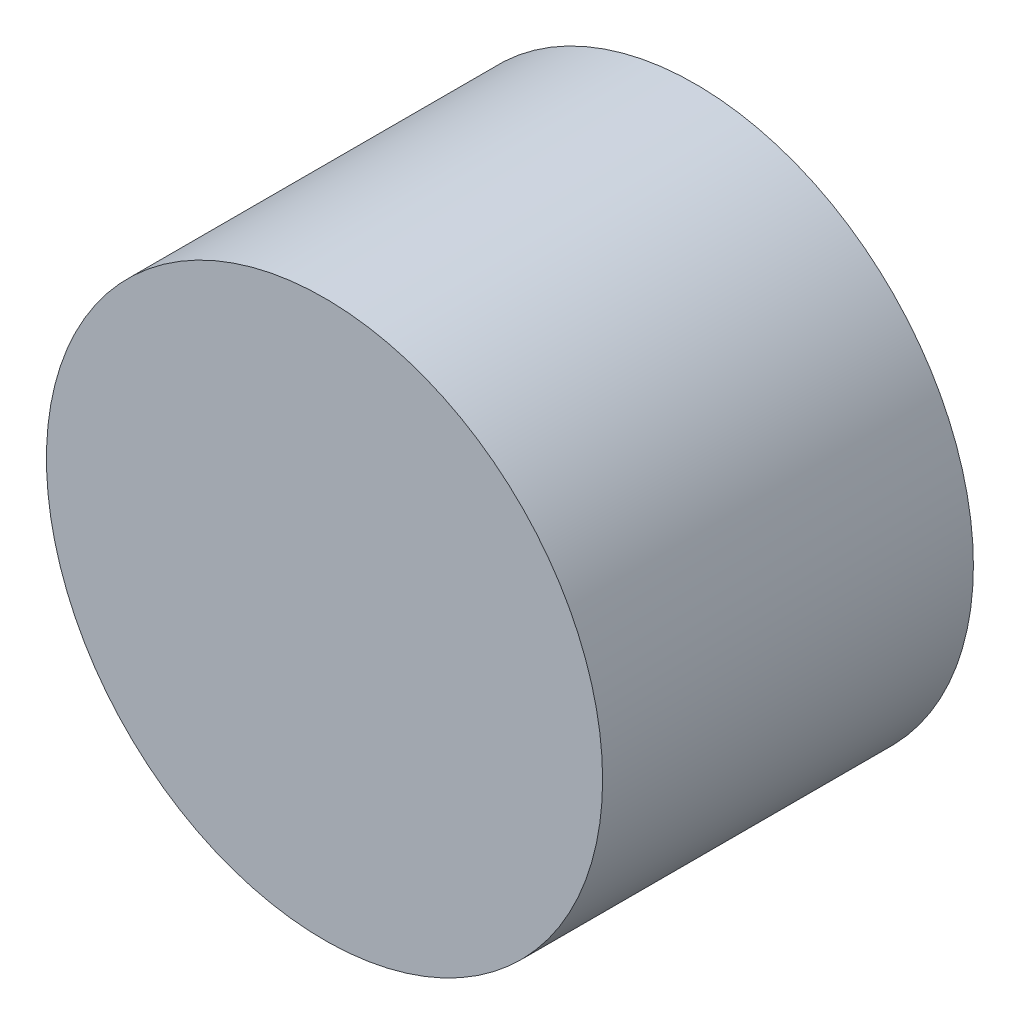
ISO-10303-21;
HEADER;
FILE_DESCRIPTION(('STEP AP214'),'2;1');
FILE_NAME('part.step','',(''),(''),'','','');
FILE_SCHEMA(('AUTOMOTIVE_DESIGN { 1 0 10303 214 1 1 1 1 }'));
ENDSEC;
DATA;
#1=APPLICATION_CONTEXT('core data for automotive mechanical design processes');
#2=APPLICATION_PROTOCOL_DEFINITION('international standard','automotive_design',2000,#1);
#3=PRODUCT_CONTEXT('',#1,'mechanical');
#4=PRODUCT('Part','Part','',(#3));
#5=PRODUCT_RELATED_PRODUCT_CATEGORY('part','',(#4));
#6=PRODUCT_DEFINITION_FORMATION('','',#4);
#7=PRODUCT_DEFINITION_CONTEXT('part definition',#1,'design');
#8=PRODUCT_DEFINITION('design','',#6,#7);
#9=PRODUCT_DEFINITION_SHAPE('','',#8);
#10=(LENGTH_UNIT() NAMED_UNIT(*) SI_UNIT(.MILLI.,.METRE.));
#11=(NAMED_UNIT(*) PLANE_ANGLE_UNIT() SI_UNIT($,.RADIAN.));
#12=(NAMED_UNIT(*) SI_UNIT($,.STERADIAN.) SOLID_ANGLE_UNIT());
#13=UNCERTAINTY_MEASURE_WITH_UNIT(LENGTH_MEASURE(1.E-05),#10,'distance_accuracy_value','');
#14=(GEOMETRIC_REPRESENTATION_CONTEXT(3) GLOBAL_UNCERTAINTY_ASSIGNED_CONTEXT((#13)) GLOBAL_UNIT_ASSIGNED_CONTEXT((#10,
#11,#12)) REPRESENTATION_CONTEXT('',''));
#15=CARTESIAN_POINT('',(0.,0.,0.));
#16=DIRECTION('',(0.,0.,1.));
#17=DIRECTION('',(1.,0.,0.));
#18=AXIS2_PLACEMENT_3D('',#15,#16,#17);
#19=CARTESIAN_POINT('',(0.,0.,5.));
#20=DIRECTION('',(0.,0.,-1.));
#21=DIRECTION('',(-1.,0.,0.));
#22=AXIS2_PLACEMENT_3D('',#19,#20,#21);
#23=CYLINDRICAL_SURFACE('',#22,3.75);
#24=CARTESIAN_POINT('',(0.,0.,5.));
#25=DIRECTION('',(0.,0.,1.));
#26=DIRECTION('',(1.,0.,0.));
#27=AXIS2_PLACEMENT_3D('',#24,#25,#26);
#28=CIRCLE('',#27,3.75);
#29=CARTESIAN_POINT('',(3.75,0.,5.));
#30=VERTEX_POINT('',#29);
#31=EDGE_CURVE('E10',#30,#30,#28,.T.);
#32=ORIENTED_EDGE('',*,*,#31,.F.);
#33=EDGE_LOOP('',(#32));
#34=FACE_BOUND('',#33,.T.);
#35=CARTESIAN_POINT('',(0.,0.,0.));
#36=DIRECTION('',(0.,0.,1.));
#37=DIRECTION('',(1.,0.,0.));
#38=AXIS2_PLACEMENT_3D('',#35,#36,#37);
#39=CIRCLE('',#38,3.75);
#40=CARTESIAN_POINT('',(3.75,0.,0.));
#41=VERTEX_POINT('',#40);
#42=EDGE_CURVE('E40',#41,#41,#39,.T.);
#43=ORIENTED_EDGE('',*,*,#42,.T.);
#44=EDGE_LOOP('',(#43));
#45=FACE_BOUND('',#44,.T.);
#46=ADVANCED_FACE('F37',(#34,#45),#23,.T.);
#47=CARTESIAN_POINT('',(0.,0.,5.));
#48=DIRECTION('',(0.,0.,1.));
#49=DIRECTION('',(1.,0.,0.));
#50=AXIS2_PLACEMENT_3D('',#47,#48,#49);
#51=PLANE('',#50);
#52=ORIENTED_EDGE('',*,*,#31,.T.);
#53=EDGE_LOOP('',(#52));
#54=FACE_BOUND('',#53,.T.);
#55=ADVANCED_FACE('F54',(#54),#51,.T.);
#56=CARTESIAN_POINT('',(0.,0.,0.));
#57=DIRECTION('',(0.,0.,1.));
#58=DIRECTION('',(1.,0.,0.));
#59=AXIS2_PLACEMENT_3D('',#56,#57,#58);
#60=PLANE('',#59);
#61=ORIENTED_EDGE('',*,*,#42,.F.);
#62=EDGE_LOOP('',(#61));
#63=FACE_BOUND('',#62,.T.);
#64=ADVANCED_FACE('F52',(#63),#60,.F.);
#65=CLOSED_SHELL('',(#46,#55,#64));
#66=MANIFOLD_SOLID_BREP('B2',#65);
#67=ADVANCED_BREP_SHAPE_REPRESENTATION('',(#18,#66),#14);
#68=SHAPE_DEFINITION_REPRESENTATION(#9,#67);
ENDSEC;
END-ISO-10303-21;
